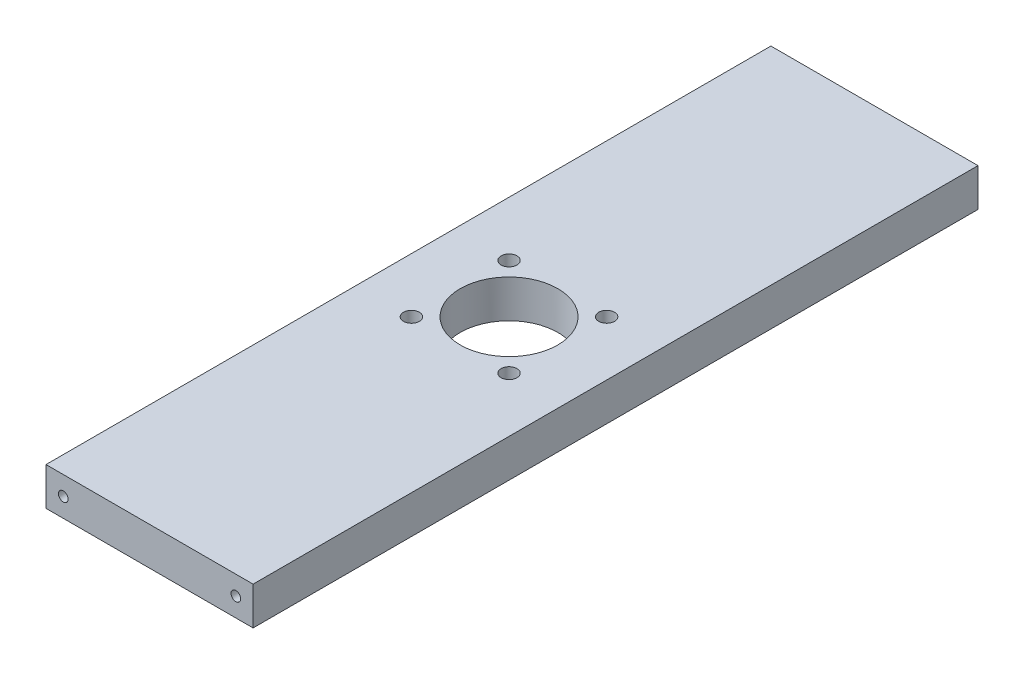
ISO-10303-21;
HEADER;
FILE_DESCRIPTION(('STEP AP214'),'2;1');
FILE_NAME('part.step','',(''),(''),'','','');
FILE_SCHEMA(('AUTOMOTIVE_DESIGN { 1 0 10303 214 1 1 1 1 }'));
ENDSEC;
DATA;
#1=APPLICATION_CONTEXT('core data for automotive mechanical design processes');
#2=APPLICATION_PROTOCOL_DEFINITION('international standard','automotive_design',2000,#1);
#3=PRODUCT_CONTEXT('',#1,'mechanical');
#4=PRODUCT('Part','Part','',(#3));
#5=PRODUCT_RELATED_PRODUCT_CATEGORY('part','',(#4));
#6=PRODUCT_DEFINITION_FORMATION('','',#4);
#7=PRODUCT_DEFINITION_CONTEXT('part definition',#1,'design');
#8=PRODUCT_DEFINITION('design','',#6,#7);
#9=PRODUCT_DEFINITION_SHAPE('','',#8);
#10=(LENGTH_UNIT() NAMED_UNIT(*) SI_UNIT(.MILLI.,.METRE.));
#11=(NAMED_UNIT(*) PLANE_ANGLE_UNIT() SI_UNIT($,.RADIAN.));
#12=(NAMED_UNIT(*) SI_UNIT($,.STERADIAN.) SOLID_ANGLE_UNIT());
#13=UNCERTAINTY_MEASURE_WITH_UNIT(LENGTH_MEASURE(1.E-05),#10,'distance_accuracy_value','');
#14=(GEOMETRIC_REPRESENTATION_CONTEXT(3) GLOBAL_UNCERTAINTY_ASSIGNED_CONTEXT((#13)) GLOBAL_UNIT_ASSIGNED_CONTEXT((#10,
#11,#12)) REPRESENTATION_CONTEXT('',''));
#15=CARTESIAN_POINT('',(0.,0.,0.));
#16=DIRECTION('',(0.,0.,1.));
#17=DIRECTION('',(1.,0.,0.));
#18=AXIS2_PLACEMENT_3D('',#15,#16,#17);
#19=CARTESIAN_POINT('',(-26.1381046087792,10.0518355359765,210.));
#20=DIRECTION('',(1.,0.,0.));
#21=DIRECTION('',(0.,0.,-1.));
#22=AXIS2_PLACEMENT_3D('',#19,#20,#21);
#23=PLANE('',#22);
#24=DIRECTION('',(0.,-1.,0.));
#25=VECTOR('',#24,1.);
#26=CARTESIAN_POINT('',(-26.1381046087792,10.0518355359765,0.));
#27=LINE('',#26,#25);
#28=CARTESIAN_POINT('',(-26.1381046087792,10.0518355359765,0.));
#29=VERTEX_POINT('',#28);
#30=CARTESIAN_POINT('',(-26.1381046087792,-0.948164464023505,0.));
#31=VERTEX_POINT('',#30);
#32=EDGE_CURVE('E98',#29,#31,#27,.T.);
#33=ORIENTED_EDGE('',*,*,#32,.T.);
#34=DIRECTION('',(0.,0.,-1.));
#35=VECTOR('',#34,1.);
#36=CARTESIAN_POINT('',(-26.1381046087792,-0.948164464023505,210.));
#37=LINE('',#36,#35);
#38=CARTESIAN_POINT('',(-26.1381046087792,-0.948164464023505,210.));
#39=VERTEX_POINT('',#38);
#40=EDGE_CURVE('E11',#39,#31,#37,.T.);
#41=ORIENTED_EDGE('',*,*,#40,.F.);
#42=DIRECTION('',(0.,-1.,0.));
#43=VECTOR('',#42,1.);
#44=CARTESIAN_POINT('',(-26.1381046087792,10.0518355359765,210.));
#45=LINE('',#44,#43);
#46=CARTESIAN_POINT('',(-26.1381046087792,10.0518355359765,210.));
#47=VERTEX_POINT('',#46);
#48=EDGE_CURVE('E85',#47,#39,#45,.T.);
#49=ORIENTED_EDGE('',*,*,#48,.F.);
#50=DIRECTION('',(0.,0.,-1.));
#51=VECTOR('',#50,1.);
#52=CARTESIAN_POINT('',(-26.1381046087792,10.0518355359765,210.));
#53=LINE('',#52,#51);
#54=EDGE_CURVE('E94',#47,#29,#53,.T.);
#55=ORIENTED_EDGE('',*,*,#54,.T.);
#56=EDGE_LOOP('',(#33,#41,#49,#55));
#57=FACE_BOUND('',#56,.T.);
#58=ADVANCED_FACE('F32',(#57),#23,.F.);
#59=CARTESIAN_POINT('',(-26.1381046087792,-0.948164464023505,210.));
#60=DIRECTION('',(0.,1.,0.));
#61=DIRECTION('',(0.,0.,1.));
#62=AXIS2_PLACEMENT_3D('',#59,#60,#61);
#63=PLANE('',#62);
#64=CARTESIAN_POINT('',(18.0018953912208,-0.948164464023505,120.));
#65=DIRECTION('',(0.,1.,0.));
#66=DIRECTION('',(0.,0.,1.));
#67=AXIS2_PLACEMENT_3D('',#64,#65,#66);
#68=CIRCLE('',#67,2.3);
#69=CARTESIAN_POINT('',(18.0018953912208,-0.948164464023505,122.3));
#70=VERTEX_POINT('',#69);
#71=EDGE_CURVE('E270',#70,#70,#68,.T.);
#72=ORIENTED_EDGE('',*,*,#71,.T.);
#73=EDGE_LOOP('',(#72));
#74=FACE_BOUND('',#73,.T.);
#75=CARTESIAN_POINT('',(-10.2781046087792,-0.948164464023505,120.));
#76=DIRECTION('',(0.,1.,0.));
#77=DIRECTION('',(0.,0.,1.));
#78=AXIS2_PLACEMENT_3D('',#75,#76,#77);
#79=CIRCLE('',#78,2.3);
#80=CARTESIAN_POINT('',(-10.2781046087792,-0.948164464023505,122.3));
#81=VERTEX_POINT('',#80);
#82=EDGE_CURVE('E265',#81,#81,#79,.T.);
#83=ORIENTED_EDGE('',*,*,#82,.T.);
#84=EDGE_LOOP('',(#83));
#85=FACE_BOUND('',#84,.T.);
#86=CARTESIAN_POINT('',(18.0018953912208,-0.948164464023505,91.72));
#87=DIRECTION('',(0.,1.,0.));
#88=DIRECTION('',(0.,0.,1.));
#89=AXIS2_PLACEMENT_3D('',#86,#87,#88);
#90=CIRCLE('',#89,2.3);
#91=CARTESIAN_POINT('',(18.0018953912208,-0.948164464023505,94.02));
#92=VERTEX_POINT('',#91);
#93=EDGE_CURVE('E254',#92,#92,#90,.T.);
#94=ORIENTED_EDGE('',*,*,#93,.T.);
#95=EDGE_LOOP('',(#94));
#96=FACE_BOUND('',#95,.T.);
#97=CARTESIAN_POINT('',(-10.2781046087792,-0.948164464023505,91.72));
#98=DIRECTION('',(0.,1.,0.));
#99=DIRECTION('',(0.,0.,1.));
#100=AXIS2_PLACEMENT_3D('',#97,#98,#99);
#101=CIRCLE('',#100,2.3);
#102=CARTESIAN_POINT('',(-10.2781046087792,-0.948164464023505,94.02));
#103=VERTEX_POINT('',#102);
#104=EDGE_CURVE('E264',#103,#103,#101,.T.);
#105=ORIENTED_EDGE('',*,*,#104,.T.);
#106=EDGE_LOOP('',(#105));
#107=FACE_BOUND('',#106,.T.);
#108=CARTESIAN_POINT('',(3.86189539122077,-0.948164464023505,105.86));
#109=DIRECTION('',(0.,1.,0.));
#110=DIRECTION('',(0.,0.,1.));
#111=AXIS2_PLACEMENT_3D('',#108,#109,#110);
#112=CIRCLE('',#111,14.14);
#113=CARTESIAN_POINT('',(3.86189539122077,-0.948164464023505,120.));
#114=VERTEX_POINT('',#113);
#115=EDGE_CURVE('E110',#114,#114,#112,.T.);
#116=ORIENTED_EDGE('',*,*,#115,.T.);
#117=EDGE_LOOP('',(#116));
#118=FACE_BOUND('',#117,.T.);
#119=DIRECTION('',(1.,0.,0.));
#120=VECTOR('',#119,1.);
#121=CARTESIAN_POINT('',(-26.1381046087792,-0.948164464023505,0.));
#122=LINE('',#121,#120);
#123=CARTESIAN_POINT('',(33.8618953912208,-0.948164464023505,0.));
#124=VERTEX_POINT('',#123);
#125=EDGE_CURVE('E89',#31,#124,#122,.T.);
#126=ORIENTED_EDGE('',*,*,#125,.T.);
#127=DIRECTION('',(0.,0.,-1.));
#128=VECTOR('',#127,1.);
#129=CARTESIAN_POINT('',(33.8618953912208,-0.948164464023505,210.));
#130=LINE('',#129,#128);
#131=CARTESIAN_POINT('',(33.8618953912208,-0.948164464023505,210.));
#132=VERTEX_POINT('',#131);
#133=EDGE_CURVE('E41',#132,#124,#130,.T.);
#134=ORIENTED_EDGE('',*,*,#133,.F.);
#135=DIRECTION('',(1.,0.,0.));
#136=VECTOR('',#135,1.);
#137=CARTESIAN_POINT('',(-26.1381046087792,-0.948164464023505,210.));
#138=LINE('',#137,#136);
#139=EDGE_CURVE('E80',#39,#132,#138,.T.);
#140=ORIENTED_EDGE('',*,*,#139,.F.);
#141=ORIENTED_EDGE('',*,*,#40,.T.);
#142=EDGE_LOOP('',(#126,#134,#140,#141));
#143=FACE_BOUND('',#142,.T.);
#144=ADVANCED_FACE('F88',(#74,#85,#96,#107,#118,#143),#63,.F.);
#145=CARTESIAN_POINT('',(33.8618953912208,10.0518355359765,210.));
#146=DIRECTION('',(-1.,0.,0.));
#147=DIRECTION('',(0.,0.,1.));
#148=AXIS2_PLACEMENT_3D('',#145,#146,#147);
#149=PLANE('',#148);
#150=DIRECTION('',(0.,1.,0.));
#151=VECTOR('',#150,1.);
#152=CARTESIAN_POINT('',(33.8618953912208,10.0518355359765,0.));
#153=LINE('',#152,#151);
#154=CARTESIAN_POINT('',(33.8618953912208,10.0518355359765,0.));
#155=VERTEX_POINT('',#154);
#156=EDGE_CURVE('E67',#124,#155,#153,.T.);
#157=ORIENTED_EDGE('',*,*,#156,.T.);
#158=DIRECTION('',(0.,0.,-1.));
#159=VECTOR('',#158,1.);
#160=CARTESIAN_POINT('',(33.8618953912208,10.0518355359765,210.));
#161=LINE('',#160,#159);
#162=CARTESIAN_POINT('',(33.8618953912208,10.0518355359765,210.));
#163=VERTEX_POINT('',#162);
#164=EDGE_CURVE('E90',#163,#155,#161,.T.);
#165=ORIENTED_EDGE('',*,*,#164,.F.);
#166=DIRECTION('',(0.,1.,0.));
#167=VECTOR('',#166,1.);
#168=CARTESIAN_POINT('',(33.8618953912208,10.0518355359765,210.));
#169=LINE('',#168,#167);
#170=EDGE_CURVE('E83',#132,#163,#169,.T.);
#171=ORIENTED_EDGE('',*,*,#170,.F.);
#172=ORIENTED_EDGE('',*,*,#133,.T.);
#173=EDGE_LOOP('',(#157,#165,#171,#172));
#174=FACE_BOUND('',#173,.T.);
#175=ADVANCED_FACE('F92',(#174),#149,.F.);
#176=CARTESIAN_POINT('',(-26.1381046087792,10.0518355359765,210.));
#177=DIRECTION('',(0.,-1.,0.));
#178=DIRECTION('',(0.,0.,-1.));
#179=AXIS2_PLACEMENT_3D('',#176,#177,#178);
#180=PLANE('',#179);
#181=CARTESIAN_POINT('',(18.0018953912208,10.0518355359765,120.));
#182=DIRECTION('',(0.,-1.,0.));
#183=DIRECTION('',(0.,0.,-1.));
#184=AXIS2_PLACEMENT_3D('',#181,#182,#183);
#185=CIRCLE('',#184,2.3);
#186=CARTESIAN_POINT('',(18.0018953912208,10.0518355359765,117.7));
#187=VERTEX_POINT('',#186);
#188=EDGE_CURVE('E35',#187,#187,#185,.T.);
#189=ORIENTED_EDGE('',*,*,#188,.T.);
#190=EDGE_LOOP('',(#189));
#191=FACE_BOUND('',#190,.T.);
#192=CARTESIAN_POINT('',(-10.2781046087792,10.0518355359765,120.));
#193=DIRECTION('',(0.,-1.,0.));
#194=DIRECTION('',(0.,0.,-1.));
#195=AXIS2_PLACEMENT_3D('',#192,#193,#194);
#196=CIRCLE('',#195,2.3);
#197=CARTESIAN_POINT('',(-10.2781046087792,10.0518355359765,117.7));
#198=VERTEX_POINT('',#197);
#199=EDGE_CURVE('E115',#198,#198,#196,.T.);
#200=ORIENTED_EDGE('',*,*,#199,.T.);
#201=EDGE_LOOP('',(#200));
#202=FACE_BOUND('',#201,.T.);
#203=CARTESIAN_POINT('',(18.0018953912208,10.0518355359765,91.72));
#204=DIRECTION('',(0.,-1.,0.));
#205=DIRECTION('',(0.,0.,-1.));
#206=AXIS2_PLACEMENT_3D('',#203,#204,#205);
#207=CIRCLE('',#206,2.3);
#208=CARTESIAN_POINT('',(18.0018953912208,10.0518355359765,89.42));
#209=VERTEX_POINT('',#208);
#210=EDGE_CURVE('E113',#209,#209,#207,.T.);
#211=ORIENTED_EDGE('',*,*,#210,.T.);
#212=EDGE_LOOP('',(#211));
#213=FACE_BOUND('',#212,.T.);
#214=CARTESIAN_POINT('',(-10.2781046087792,10.0518355359765,91.72));
#215=DIRECTION('',(0.,-1.,0.));
#216=DIRECTION('',(0.,0.,-1.));
#217=AXIS2_PLACEMENT_3D('',#214,#215,#216);
#218=CIRCLE('',#217,2.3);
#219=CARTESIAN_POINT('',(-10.2781046087792,10.0518355359765,89.42));
#220=VERTEX_POINT('',#219);
#221=EDGE_CURVE('E109',#220,#220,#218,.T.);
#222=ORIENTED_EDGE('',*,*,#221,.T.);
#223=EDGE_LOOP('',(#222));
#224=FACE_BOUND('',#223,.T.);
#225=CARTESIAN_POINT('',(3.86189539122077,10.0518355359765,105.86));
#226=DIRECTION('',(0.,-1.,0.));
#227=DIRECTION('',(0.,0.,-1.));
#228=AXIS2_PLACEMENT_3D('',#225,#226,#227);
#229=CIRCLE('',#228,14.14);
#230=CARTESIAN_POINT('',(3.86189539122077,10.0518355359765,91.72));
#231=VERTEX_POINT('',#230);
#232=EDGE_CURVE('E106',#231,#231,#229,.T.);
#233=ORIENTED_EDGE('',*,*,#232,.T.);
#234=EDGE_LOOP('',(#233));
#235=FACE_BOUND('',#234,.T.);
#236=DIRECTION('',(-1.,0.,0.));
#237=VECTOR('',#236,1.);
#238=CARTESIAN_POINT('',(-26.1381046087792,10.0518355359765,0.));
#239=LINE('',#238,#237);
#240=EDGE_CURVE('E73',#155,#29,#239,.T.);
#241=ORIENTED_EDGE('',*,*,#240,.T.);
#242=ORIENTED_EDGE('',*,*,#54,.F.);
#243=DIRECTION('',(-1.,0.,0.));
#244=VECTOR('',#243,1.);
#245=CARTESIAN_POINT('',(-26.1381046087792,10.0518355359765,210.));
#246=LINE('',#245,#244);
#247=EDGE_CURVE('E50',#163,#47,#246,.T.);
#248=ORIENTED_EDGE('',*,*,#247,.F.);
#249=ORIENTED_EDGE('',*,*,#164,.T.);
#250=EDGE_LOOP('',(#241,#242,#248,#249));
#251=FACE_BOUND('',#250,.T.);
#252=ADVANCED_FACE('F122',(#191,#202,#213,#224,#235,#251),#180,.F.);
#253=CARTESIAN_POINT('',(0.,0.,210.));
#254=DIRECTION('',(0.,0.,1.));
#255=DIRECTION('',(1.,0.,0.));
#256=AXIS2_PLACEMENT_3D('',#253,#254,#255);
#257=PLANE('',#256);
#258=CARTESIAN_POINT('',(-21.1381046087792,4.55183553597649,210.));
#259=DIRECTION('',(0.,0.,1.));
#260=DIRECTION('',(1.,0.,0.));
#261=AXIS2_PLACEMENT_3D('',#258,#259,#260);
#262=CIRCLE('',#261,1.4);
#263=CARTESIAN_POINT('',(-19.7381046087792,4.55183553597649,210.));
#264=VERTEX_POINT('',#263);
#265=EDGE_CURVE('E297',#264,#264,#262,.T.);
#266=ORIENTED_EDGE('',*,*,#265,.F.);
#267=EDGE_LOOP('',(#266));
#268=FACE_BOUND('',#267,.T.);
#269=CARTESIAN_POINT('',(28.8618953912208,4.55183553597649,210.));
#270=DIRECTION('',(0.,0.,1.));
#271=DIRECTION('',(1.,0.,0.));
#272=AXIS2_PLACEMENT_3D('',#269,#270,#271);
#273=CIRCLE('',#272,1.4);
#274=CARTESIAN_POINT('',(30.2618953912208,4.55183553597649,210.));
#275=VERTEX_POINT('',#274);
#276=EDGE_CURVE('E288',#275,#275,#273,.T.);
#277=ORIENTED_EDGE('',*,*,#276,.F.);
#278=EDGE_LOOP('',(#277));
#279=FACE_BOUND('',#278,.T.);
#280=ORIENTED_EDGE('',*,*,#48,.T.);
#281=ORIENTED_EDGE('',*,*,#139,.T.);
#282=ORIENTED_EDGE('',*,*,#170,.T.);
#283=ORIENTED_EDGE('',*,*,#247,.T.);
#284=EDGE_LOOP('',(#280,#281,#282,#283));
#285=FACE_BOUND('',#284,.T.);
#286=ADVANCED_FACE('F81',(#268,#279,#285),#257,.T.);
#287=CARTESIAN_POINT('',(0.,0.,0.));
#288=DIRECTION('',(0.,0.,1.));
#289=DIRECTION('',(1.,0.,0.));
#290=AXIS2_PLACEMENT_3D('',#287,#288,#289);
#291=PLANE('',#290);
#292=CARTESIAN_POINT('',(-21.1381046087792,4.55183553597649,0.));
#293=DIRECTION('',(0.,0.,-1.));
#294=DIRECTION('',(-1.,0.,0.));
#295=AXIS2_PLACEMENT_3D('',#292,#293,#294);
#296=CIRCLE('',#295,1.4);
#297=CARTESIAN_POINT('',(-22.5381046087792,4.55183553597649,0.));
#298=VERTEX_POINT('',#297);
#299=EDGE_CURVE('E281',#298,#298,#296,.T.);
#300=ORIENTED_EDGE('',*,*,#299,.F.);
#301=EDGE_LOOP('',(#300));
#302=FACE_BOUND('',#301,.T.);
#303=CARTESIAN_POINT('',(28.8618953912208,4.55183553597649,0.));
#304=DIRECTION('',(0.,0.,-1.));
#305=DIRECTION('',(-1.,0.,0.));
#306=AXIS2_PLACEMENT_3D('',#303,#304,#305);
#307=CIRCLE('',#306,1.4);
#308=CARTESIAN_POINT('',(27.4618953912208,4.55183553597649,0.));
#309=VERTEX_POINT('',#308);
#310=EDGE_CURVE('E292',#309,#309,#307,.T.);
#311=ORIENTED_EDGE('',*,*,#310,.F.);
#312=EDGE_LOOP('',(#311));
#313=FACE_BOUND('',#312,.T.);
#314=ORIENTED_EDGE('',*,*,#32,.F.);
#315=ORIENTED_EDGE('',*,*,#240,.F.);
#316=ORIENTED_EDGE('',*,*,#156,.F.);
#317=ORIENTED_EDGE('',*,*,#125,.F.);
#318=EDGE_LOOP('',(#314,#315,#316,#317));
#319=FACE_BOUND('',#318,.T.);
#320=ADVANCED_FACE('F150',(#302,#313,#319),#291,.F.);
#321=CARTESIAN_POINT('',(3.86189539122077,-0.948164464023505,105.86));
#322=DIRECTION('',(0.,1.,0.));
#323=DIRECTION('',(0.,0.,1.));
#324=AXIS2_PLACEMENT_3D('',#321,#322,#323);
#325=CYLINDRICAL_SURFACE('',#324,14.14);
#326=ORIENTED_EDGE('',*,*,#115,.F.);
#327=EDGE_LOOP('',(#326));
#328=FACE_BOUND('',#327,.T.);
#329=ORIENTED_EDGE('',*,*,#232,.F.);
#330=EDGE_LOOP('',(#329));
#331=FACE_BOUND('',#330,.T.);
#332=ADVANCED_FACE('F152',(#328,#331),#325,.F.);
#333=CARTESIAN_POINT('',(-10.2781046087792,-0.948164464023505,91.72));
#334=DIRECTION('',(0.,1.,0.));
#335=DIRECTION('',(0.,0.,1.));
#336=AXIS2_PLACEMENT_3D('',#333,#334,#335);
#337=CYLINDRICAL_SURFACE('',#336,2.3);
#338=ORIENTED_EDGE('',*,*,#104,.F.);
#339=EDGE_LOOP('',(#338));
#340=FACE_BOUND('',#339,.T.);
#341=ORIENTED_EDGE('',*,*,#221,.F.);
#342=EDGE_LOOP('',(#341));
#343=FACE_BOUND('',#342,.T.);
#344=ADVANCED_FACE('F159',(#340,#343),#337,.F.);
#345=CARTESIAN_POINT('',(18.0018953912208,-0.948164464023505,91.72));
#346=DIRECTION('',(0.,1.,0.));
#347=DIRECTION('',(0.,0.,1.));
#348=AXIS2_PLACEMENT_3D('',#345,#346,#347);
#349=CYLINDRICAL_SURFACE('',#348,2.3);
#350=ORIENTED_EDGE('',*,*,#93,.F.);
#351=EDGE_LOOP('',(#350));
#352=FACE_BOUND('',#351,.T.);
#353=ORIENTED_EDGE('',*,*,#210,.F.);
#354=EDGE_LOOP('',(#353));
#355=FACE_BOUND('',#354,.T.);
#356=ADVANCED_FACE('F137',(#352,#355),#349,.F.);
#357=CARTESIAN_POINT('',(-10.2781046087792,-0.948164464023505,120.));
#358=DIRECTION('',(0.,1.,0.));
#359=DIRECTION('',(0.,0.,1.));
#360=AXIS2_PLACEMENT_3D('',#357,#358,#359);
#361=CYLINDRICAL_SURFACE('',#360,2.3);
#362=ORIENTED_EDGE('',*,*,#82,.F.);
#363=EDGE_LOOP('',(#362));
#364=FACE_BOUND('',#363,.T.);
#365=ORIENTED_EDGE('',*,*,#199,.F.);
#366=EDGE_LOOP('',(#365));
#367=FACE_BOUND('',#366,.T.);
#368=ADVANCED_FACE('F127',(#364,#367),#361,.F.);
#369=CARTESIAN_POINT('',(18.0018953912208,-0.948164464023505,120.));
#370=DIRECTION('',(0.,1.,0.));
#371=DIRECTION('',(0.,0.,1.));
#372=AXIS2_PLACEMENT_3D('',#369,#370,#371);
#373=CYLINDRICAL_SURFACE('',#372,2.3);
#374=ORIENTED_EDGE('',*,*,#71,.F.);
#375=EDGE_LOOP('',(#374));
#376=FACE_BOUND('',#375,.T.);
#377=ORIENTED_EDGE('',*,*,#188,.F.);
#378=EDGE_LOOP('',(#377));
#379=FACE_BOUND('',#378,.T.);
#380=ADVANCED_FACE('F124',(#376,#379),#373,.F.);
#381=CARTESIAN_POINT('',(28.8618953912208,4.55183553597649,21.));
#382=DIRECTION('',(0.,0.,-1.));
#383=DIRECTION('',(-1.,0.,0.));
#384=AXIS2_PLACEMENT_3D('',#381,#382,#383);
#385=CYLINDRICAL_SURFACE('',#384,1.4);
#386=CARTESIAN_POINT('',(28.8618953912208,4.55183553597649,21.));
#387=DIRECTION('',(0.,0.,-1.));
#388=DIRECTION('',(-1.,0.,0.));
#389=AXIS2_PLACEMENT_3D('',#386,#387,#388);
#390=CIRCLE('',#389,1.4);
#391=CARTESIAN_POINT('',(27.4618953912208,4.55183553597649,21.));
#392=VERTEX_POINT('',#391);
#393=EDGE_CURVE('E285',#392,#392,#390,.T.);
#394=CARTESIAN_POINT('',(27.4618953912208,4.55183553597649,21.));
#395=CARTESIAN_POINT('',(27.4618953912208,4.55183553597649,20.78125));
#396=CARTESIAN_POINT('',(27.4618953912208,4.55183553597649,20.5625));
#397=CARTESIAN_POINT('',(27.4618953912208,4.55183553597649,20.125));
#398=CARTESIAN_POINT('',(27.4618953912208,4.55183553597649,19.90625));
#399=CARTESIAN_POINT('',(27.4618953912208,4.55183553597649,19.46875));
#400=CARTESIAN_POINT('',(27.4618953912208,4.55183553597649,19.25));
#401=CARTESIAN_POINT('',(27.4618953912208,4.55183553597649,18.8125));
#402=CARTESIAN_POINT('',(27.4618953912208,4.55183553597649,18.59375));
#403=CARTESIAN_POINT('',(27.4618953912208,4.55183553597649,18.15625));
#404=CARTESIAN_POINT('',(27.4618953912208,4.55183553597649,17.9375));
#405=CARTESIAN_POINT('',(27.4618953912208,4.55183553597649,17.5));
#406=CARTESIAN_POINT('',(27.4618953912208,4.55183553597649,17.28125));
#407=CARTESIAN_POINT('',(27.4618953912208,4.55183553597649,16.84375));
#408=CARTESIAN_POINT('',(27.4618953912208,4.55183553597649,16.625));
#409=CARTESIAN_POINT('',(27.4618953912208,4.55183553597649,16.1875));
#410=CARTESIAN_POINT('',(27.4618953912208,4.55183553597649,15.96875));
#411=CARTESIAN_POINT('',(27.4618953912208,4.55183553597649,15.53125));
#412=CARTESIAN_POINT('',(27.4618953912208,4.55183553597649,15.3125));
#413=CARTESIAN_POINT('',(27.4618953912208,4.55183553597649,14.875));
#414=CARTESIAN_POINT('',(27.4618953912208,4.55183553597649,14.65625));
#415=CARTESIAN_POINT('',(27.4618953912208,4.55183553597649,14.21875));
#416=CARTESIAN_POINT('',(27.4618953912208,4.55183553597649,14.));
#417=CARTESIAN_POINT('',(27.4618953912208,4.55183553597649,13.5625));
#418=CARTESIAN_POINT('',(27.4618953912208,4.55183553597649,13.34375));
#419=CARTESIAN_POINT('',(27.4618953912208,4.55183553597649,12.90625));
#420=CARTESIAN_POINT('',(27.4618953912208,4.55183553597649,12.6875));
#421=CARTESIAN_POINT('',(27.4618953912208,4.55183553597649,12.25));
#422=CARTESIAN_POINT('',(27.4618953912208,4.55183553597649,12.03125));
#423=CARTESIAN_POINT('',(27.4618953912208,4.55183553597649,11.59375));
#424=CARTESIAN_POINT('',(27.4618953912208,4.55183553597649,11.375));
#425=CARTESIAN_POINT('',(27.4618953912208,4.55183553597649,10.9375));
#426=CARTESIAN_POINT('',(27.4618953912208,4.55183553597649,10.71875));
#427=CARTESIAN_POINT('',(27.4618953912208,4.55183553597649,10.28125));
#428=CARTESIAN_POINT('',(27.4618953912208,4.55183553597649,10.0625));
#429=CARTESIAN_POINT('',(27.4618953912208,4.55183553597649,9.625));
#430=CARTESIAN_POINT('',(27.4618953912208,4.55183553597649,9.40625));
#431=CARTESIAN_POINT('',(27.4618953912208,4.55183553597649,8.96875));
#432=CARTESIAN_POINT('',(27.4618953912208,4.55183553597649,8.75));
#433=CARTESIAN_POINT('',(27.4618953912208,4.55183553597649,8.3125));
#434=CARTESIAN_POINT('',(27.4618953912208,4.55183553597649,8.09375));
#435=CARTESIAN_POINT('',(27.4618953912208,4.55183553597649,7.65625));
#436=CARTESIAN_POINT('',(27.4618953912208,4.55183553597649,7.4375));
#437=CARTESIAN_POINT('',(27.4618953912208,4.55183553597649,7.));
#438=CARTESIAN_POINT('',(27.4618953912208,4.55183553597649,6.78125));
#439=CARTESIAN_POINT('',(27.4618953912208,4.55183553597649,6.34375));
#440=CARTESIAN_POINT('',(27.4618953912208,4.55183553597649,6.125));
#441=CARTESIAN_POINT('',(27.4618953912208,4.55183553597649,5.6875));
#442=CARTESIAN_POINT('',(27.4618953912208,4.55183553597649,5.46875));
#443=CARTESIAN_POINT('',(27.4618953912208,4.55183553597649,5.03125));
#444=CARTESIAN_POINT('',(27.4618953912208,4.55183553597649,4.8125));
#445=CARTESIAN_POINT('',(27.4618953912208,4.55183553597649,4.375));
#446=CARTESIAN_POINT('',(27.4618953912208,4.55183553597649,4.15625));
#447=CARTESIAN_POINT('',(27.4618953912208,4.55183553597649,3.71875));
#448=CARTESIAN_POINT('',(27.4618953912208,4.55183553597649,3.5));
#449=CARTESIAN_POINT('',(27.4618953912208,4.55183553597649,3.0625));
#450=CARTESIAN_POINT('',(27.4618953912208,4.55183553597649,2.84375));
#451=CARTESIAN_POINT('',(27.4618953912208,4.55183553597649,2.40625));
#452=CARTESIAN_POINT('',(27.4618953912208,4.55183553597649,2.1875));
#453=CARTESIAN_POINT('',(27.4618953912208,4.55183553597649,1.75));
#454=CARTESIAN_POINT('',(27.4618953912208,4.55183553597649,1.53125));
#455=CARTESIAN_POINT('',(27.4618953912208,4.55183553597649,1.09375));
#456=CARTESIAN_POINT('',(27.4618953912208,4.55183553597649,0.875000000000001));
#457=CARTESIAN_POINT('',(27.4618953912208,4.55183553597649,0.4375));
#458=CARTESIAN_POINT('',(27.4618953912208,4.55183553597649,0.21875));
#459=CARTESIAN_POINT('',(27.4618953912208,4.55183553597649,0.));
#460=B_SPLINE_CURVE_WITH_KNOTS('',3,(#394,#395,#396,#397,#398,#399,#400,#401,#402,#403,#404,
#405,#406,#407,#408,#409,#410,#411,#412,#413,#414,#415,#416,#417,#418,#419,#420,#421,#422,#423,
#424,#425,#426,#427,#428,#429,#430,#431,#432,#433,#434,#435,#436,#437,#438,#439,#440,#441,#442,
#443,#444,#445,#446,#447,#448,#449,#450,#451,#452,#453,#454,#455,#456,#457,#458,#459),
.UNSPECIFIED.,.F.,.F.,(4,2,2,2,2,2,2,2,2,2,2,2,2,2,2,2,2,2,2,2,2,2,2,2,2,2,2,2,2,2,2,2,4),(0.,
0.656250000000001,1.3125,1.96875,2.625,3.28125,3.9375,4.59375,5.25,5.90625,6.5625,7.21875,7.875,
8.53125,9.1875,9.84375,10.5,11.15625,11.8125,12.46875,13.125,13.78125,14.4375,15.09375,15.75,
16.40625,17.0625,17.71875,18.375,19.03125,19.6875,20.34375,21.),.UNSPECIFIED.);
#461=EDGE_CURVE('BSEAM126',#392,#309,#460,.T.);
#462=ORIENTED_EDGE('',*,*,#393,.F.);
#463=ORIENTED_EDGE('',*,*,#310,.T.);
#464=ORIENTED_EDGE('',*,*,#461,.T.);
#465=ORIENTED_EDGE('',*,*,#461,.F.);
#466=EDGE_LOOP('',(#462,#464,#463,#465));
#467=FACE_BOUND('',#466,.T.);
#468=ADVANCED_FACE('F126',(#467),#385,.F.);
#469=CARTESIAN_POINT('',(28.8618953912208,4.55183553597649,21.));
#470=DIRECTION('',(0.,0.,-1.));
#471=DIRECTION('',(-1.,0.,0.));
#472=AXIS2_PLACEMENT_3D('',#469,#470,#471);
#473=PLANE('',#472);
#474=ORIENTED_EDGE('',*,*,#393,.T.);
#475=EDGE_LOOP('',(#474));
#476=FACE_BOUND('',#475,.T.);
#477=ADVANCED_FACE('F134',(#476),#473,.T.);
#478=CARTESIAN_POINT('',(-21.1381046087792,4.55183553597649,21.));
#479=DIRECTION('',(0.,0.,-1.));
#480=DIRECTION('',(-1.,0.,0.));
#481=AXIS2_PLACEMENT_3D('',#478,#479,#480);
#482=CYLINDRICAL_SURFACE('',#481,1.4);
#483=CARTESIAN_POINT('',(-21.1381046087792,4.55183553597649,21.));
#484=DIRECTION('',(0.,0.,-1.));
#485=DIRECTION('',(-1.,0.,0.));
#486=AXIS2_PLACEMENT_3D('',#483,#484,#485);
#487=CIRCLE('',#486,1.4);
#488=CARTESIAN_POINT('',(-22.5381046087792,4.55183553597649,21.));
#489=VERTEX_POINT('',#488);
#490=EDGE_CURVE('E276',#489,#489,#487,.T.);
#491=CARTESIAN_POINT('',(-22.5381046087792,4.55183553597649,21.));
#492=CARTESIAN_POINT('',(-22.5381046087792,4.55183553597649,20.78125));
#493=CARTESIAN_POINT('',(-22.5381046087792,4.55183553597649,20.5625));
#494=CARTESIAN_POINT('',(-22.5381046087792,4.55183553597649,20.125));
#495=CARTESIAN_POINT('',(-22.5381046087792,4.55183553597649,19.90625));
#496=CARTESIAN_POINT('',(-22.5381046087792,4.55183553597649,19.46875));
#497=CARTESIAN_POINT('',(-22.5381046087792,4.55183553597649,19.25));
#498=CARTESIAN_POINT('',(-22.5381046087792,4.55183553597649,18.8125));
#499=CARTESIAN_POINT('',(-22.5381046087792,4.55183553597649,18.59375));
#500=CARTESIAN_POINT('',(-22.5381046087792,4.55183553597649,18.15625));
#501=CARTESIAN_POINT('',(-22.5381046087792,4.55183553597649,17.9375));
#502=CARTESIAN_POINT('',(-22.5381046087792,4.55183553597649,17.5));
#503=CARTESIAN_POINT('',(-22.5381046087792,4.55183553597649,17.28125));
#504=CARTESIAN_POINT('',(-22.5381046087792,4.55183553597649,16.84375));
#505=CARTESIAN_POINT('',(-22.5381046087792,4.55183553597649,16.625));
#506=CARTESIAN_POINT('',(-22.5381046087792,4.55183553597649,16.1875));
#507=CARTESIAN_POINT('',(-22.5381046087792,4.55183553597649,15.96875));
#508=CARTESIAN_POINT('',(-22.5381046087792,4.55183553597649,15.53125));
#509=CARTESIAN_POINT('',(-22.5381046087792,4.55183553597649,15.3125));
#510=CARTESIAN_POINT('',(-22.5381046087792,4.55183553597649,14.875));
#511=CARTESIAN_POINT('',(-22.5381046087792,4.55183553597649,14.65625));
#512=CARTESIAN_POINT('',(-22.5381046087792,4.55183553597649,14.21875));
#513=CARTESIAN_POINT('',(-22.5381046087792,4.55183553597649,14.));
#514=CARTESIAN_POINT('',(-22.5381046087792,4.55183553597649,13.5625));
#515=CARTESIAN_POINT('',(-22.5381046087792,4.55183553597649,13.34375));
#516=CARTESIAN_POINT('',(-22.5381046087792,4.55183553597649,12.90625));
#517=CARTESIAN_POINT('',(-22.5381046087792,4.55183553597649,12.6875));
#518=CARTESIAN_POINT('',(-22.5381046087792,4.55183553597649,12.25));
#519=CARTESIAN_POINT('',(-22.5381046087792,4.55183553597649,12.03125));
#520=CARTESIAN_POINT('',(-22.5381046087792,4.55183553597649,11.59375));
#521=CARTESIAN_POINT('',(-22.5381046087792,4.55183553597649,11.375));
#522=CARTESIAN_POINT('',(-22.5381046087792,4.55183553597649,10.9375));
#523=CARTESIAN_POINT('',(-22.5381046087792,4.55183553597649,10.71875));
#524=CARTESIAN_POINT('',(-22.5381046087792,4.55183553597649,10.28125));
#525=CARTESIAN_POINT('',(-22.5381046087792,4.55183553597649,10.0625));
#526=CARTESIAN_POINT('',(-22.5381046087792,4.55183553597649,9.625));
#527=CARTESIAN_POINT('',(-22.5381046087792,4.55183553597649,9.40625));
#528=CARTESIAN_POINT('',(-22.5381046087792,4.55183553597649,8.96875));
#529=CARTESIAN_POINT('',(-22.5381046087792,4.55183553597649,8.75));
#530=CARTESIAN_POINT('',(-22.5381046087792,4.55183553597649,8.3125));
#531=CARTESIAN_POINT('',(-22.5381046087792,4.55183553597649,8.09375));
#532=CARTESIAN_POINT('',(-22.5381046087792,4.55183553597649,7.65625));
#533=CARTESIAN_POINT('',(-22.5381046087792,4.55183553597649,7.4375));
#534=CARTESIAN_POINT('',(-22.5381046087792,4.55183553597649,7.));
#535=CARTESIAN_POINT('',(-22.5381046087792,4.55183553597649,6.78125));
#536=CARTESIAN_POINT('',(-22.5381046087792,4.55183553597649,6.34375));
#537=CARTESIAN_POINT('',(-22.5381046087792,4.55183553597649,6.125));
#538=CARTESIAN_POINT('',(-22.5381046087792,4.55183553597649,5.6875));
#539=CARTESIAN_POINT('',(-22.5381046087792,4.55183553597649,5.46875));
#540=CARTESIAN_POINT('',(-22.5381046087792,4.55183553597649,5.03125));
#541=CARTESIAN_POINT('',(-22.5381046087792,4.55183553597649,4.8125));
#542=CARTESIAN_POINT('',(-22.5381046087792,4.55183553597649,4.375));
#543=CARTESIAN_POINT('',(-22.5381046087792,4.55183553597649,4.15625));
#544=CARTESIAN_POINT('',(-22.5381046087792,4.55183553597649,3.71875));
#545=CARTESIAN_POINT('',(-22.5381046087792,4.55183553597649,3.5));
#546=CARTESIAN_POINT('',(-22.5381046087792,4.55183553597649,3.0625));
#547=CARTESIAN_POINT('',(-22.5381046087792,4.55183553597649,2.84375));
#548=CARTESIAN_POINT('',(-22.5381046087792,4.55183553597649,2.40625));
#549=CARTESIAN_POINT('',(-22.5381046087792,4.55183553597649,2.1875));
#550=CARTESIAN_POINT('',(-22.5381046087792,4.55183553597649,1.75));
#551=CARTESIAN_POINT('',(-22.5381046087792,4.55183553597649,1.53125));
#552=CARTESIAN_POINT('',(-22.5381046087792,4.55183553597649,1.09375));
#553=CARTESIAN_POINT('',(-22.5381046087792,4.55183553597649,0.875000000000001));
#554=CARTESIAN_POINT('',(-22.5381046087792,4.55183553597649,0.4375));
#555=CARTESIAN_POINT('',(-22.5381046087792,4.55183553597649,0.21875));
#556=CARTESIAN_POINT('',(-22.5381046087792,4.55183553597649,0.));
#557=B_SPLINE_CURVE_WITH_KNOTS('',3,(#491,#492,#493,#494,#495,#496,#497,#498,#499,#500,#501,
#502,#503,#504,#505,#506,#507,#508,#509,#510,#511,#512,#513,#514,#515,#516,#517,#518,#519,#520,
#521,#522,#523,#524,#525,#526,#527,#528,#529,#530,#531,#532,#533,#534,#535,#536,#537,#538,#539,
#540,#541,#542,#543,#544,#545,#546,#547,#548,#549,#550,#551,#552,#553,#554,#555,#556),
.UNSPECIFIED.,.F.,.F.,(4,2,2,2,2,2,2,2,2,2,2,2,2,2,2,2,2,2,2,2,2,2,2,2,2,2,2,2,2,2,2,2,4),(0.,
0.656250000000001,1.3125,1.96875,2.625,3.28125,3.9375,4.59375,5.25,5.90625,6.5625,7.21875,7.875,
8.53125,9.1875,9.84375,10.5,11.15625,11.8125,12.46875,13.125,13.78125,14.4375,15.09375,15.75,
16.40625,17.0625,17.71875,18.375,19.03125,19.6875,20.34375,21.),.UNSPECIFIED.);
#558=EDGE_CURVE('BSEAM236',#489,#298,#557,.T.);
#559=ORIENTED_EDGE('',*,*,#490,.F.);
#560=ORIENTED_EDGE('',*,*,#299,.T.);
#561=ORIENTED_EDGE('',*,*,#558,.T.);
#562=ORIENTED_EDGE('',*,*,#558,.F.);
#563=EDGE_LOOP('',(#559,#561,#560,#562));
#564=FACE_BOUND('',#563,.T.);
#565=ADVANCED_FACE('F236',(#564),#482,.F.);
#566=CARTESIAN_POINT('',(-21.1381046087792,4.55183553597649,21.));
#567=DIRECTION('',(0.,0.,-1.));
#568=DIRECTION('',(-1.,0.,0.));
#569=AXIS2_PLACEMENT_3D('',#566,#567,#568);
#570=PLANE('',#569);
#571=ORIENTED_EDGE('',*,*,#490,.T.);
#572=EDGE_LOOP('',(#571));
#573=FACE_BOUND('',#572,.T.);
#574=ADVANCED_FACE('F189',(#573),#570,.T.);
#575=CARTESIAN_POINT('',(28.8618953912208,4.55183553597649,189.));
#576=DIRECTION('',(0.,0.,1.));
#577=DIRECTION('',(1.,0.,0.));
#578=AXIS2_PLACEMENT_3D('',#575,#576,#577);
#579=CYLINDRICAL_SURFACE('',#578,1.4);
#580=CARTESIAN_POINT('',(28.8618953912208,4.55183553597649,189.));
#581=DIRECTION('',(0.,0.,1.));
#582=DIRECTION('',(1.,0.,0.));
#583=AXIS2_PLACEMENT_3D('',#580,#581,#582);
#584=CIRCLE('',#583,1.4);
#585=CARTESIAN_POINT('',(30.2618953912208,4.55183553597649,189.));
#586=VERTEX_POINT('',#585);
#587=EDGE_CURVE('E301',#586,#586,#584,.T.);
#588=CARTESIAN_POINT('',(30.2618953912208,4.55183553597649,189.));
#589=CARTESIAN_POINT('',(30.2618953912208,4.55183553597649,189.21875));
#590=CARTESIAN_POINT('',(30.2618953912208,4.55183553597649,189.4375));
#591=CARTESIAN_POINT('',(30.2618953912208,4.55183553597649,189.875));
#592=CARTESIAN_POINT('',(30.2618953912208,4.55183553597649,190.09375));
#593=CARTESIAN_POINT('',(30.2618953912208,4.55183553597649,190.53125));
#594=CARTESIAN_POINT('',(30.2618953912208,4.55183553597649,190.75));
#595=CARTESIAN_POINT('',(30.2618953912208,4.55183553597649,191.1875));
#596=CARTESIAN_POINT('',(30.2618953912208,4.55183553597649,191.40625));
#597=CARTESIAN_POINT('',(30.2618953912208,4.55183553597649,191.84375));
#598=CARTESIAN_POINT('',(30.2618953912208,4.55183553597649,192.0625));
#599=CARTESIAN_POINT('',(30.2618953912208,4.55183553597649,192.5));
#600=CARTESIAN_POINT('',(30.2618953912208,4.55183553597649,192.71875));
#601=CARTESIAN_POINT('',(30.2618953912208,4.55183553597649,193.15625));
#602=CARTESIAN_POINT('',(30.2618953912208,4.55183553597649,193.375));
#603=CARTESIAN_POINT('',(30.2618953912208,4.55183553597649,193.8125));
#604=CARTESIAN_POINT('',(30.2618953912208,4.55183553597649,194.03125));
#605=CARTESIAN_POINT('',(30.2618953912208,4.55183553597649,194.46875));
#606=CARTESIAN_POINT('',(30.2618953912208,4.55183553597649,194.6875));
#607=CARTESIAN_POINT('',(30.2618953912208,4.55183553597649,195.125));
#608=CARTESIAN_POINT('',(30.2618953912208,4.55183553597649,195.34375));
#609=CARTESIAN_POINT('',(30.2618953912208,4.55183553597649,195.78125));
#610=CARTESIAN_POINT('',(30.2618953912208,4.55183553597649,196.));
#611=CARTESIAN_POINT('',(30.2618953912208,4.55183553597649,196.4375));
#612=CARTESIAN_POINT('',(30.2618953912208,4.55183553597649,196.65625));
#613=CARTESIAN_POINT('',(30.2618953912208,4.55183553597649,197.09375));
#614=CARTESIAN_POINT('',(30.2618953912208,4.55183553597649,197.3125));
#615=CARTESIAN_POINT('',(30.2618953912208,4.55183553597649,197.75));
#616=CARTESIAN_POINT('',(30.2618953912208,4.55183553597649,197.96875));
#617=CARTESIAN_POINT('',(30.2618953912208,4.55183553597649,198.40625));
#618=CARTESIAN_POINT('',(30.2618953912208,4.55183553597649,198.625));
#619=CARTESIAN_POINT('',(30.2618953912208,4.55183553597649,199.0625));
#620=CARTESIAN_POINT('',(30.2618953912208,4.55183553597649,199.28125));
#621=CARTESIAN_POINT('',(30.2618953912208,4.55183553597649,199.71875));
#622=CARTESIAN_POINT('',(30.2618953912208,4.55183553597649,199.9375));
#623=CARTESIAN_POINT('',(30.2618953912208,4.55183553597649,200.375));
#624=CARTESIAN_POINT('',(30.2618953912208,4.55183553597649,200.59375));
#625=CARTESIAN_POINT('',(30.2618953912208,4.55183553597649,201.03125));
#626=CARTESIAN_POINT('',(30.2618953912208,4.55183553597649,201.25));
#627=CARTESIAN_POINT('',(30.2618953912208,4.55183553597649,201.6875));
#628=CARTESIAN_POINT('',(30.2618953912208,4.55183553597649,201.90625));
#629=CARTESIAN_POINT('',(30.2618953912208,4.55183553597649,202.34375));
#630=CARTESIAN_POINT('',(30.2618953912208,4.55183553597649,202.5625));
#631=CARTESIAN_POINT('',(30.2618953912208,4.55183553597649,203.));
#632=CARTESIAN_POINT('',(30.2618953912208,4.55183553597649,203.21875));
#633=CARTESIAN_POINT('',(30.2618953912208,4.55183553597649,203.65625));
#634=CARTESIAN_POINT('',(30.2618953912208,4.55183553597649,203.875));
#635=CARTESIAN_POINT('',(30.2618953912208,4.55183553597649,204.3125));
#636=CARTESIAN_POINT('',(30.2618953912208,4.55183553597649,204.53125));
#637=CARTESIAN_POINT('',(30.2618953912208,4.55183553597649,204.96875));
#638=CARTESIAN_POINT('',(30.2618953912208,4.55183553597649,205.1875));
#639=CARTESIAN_POINT('',(30.2618953912208,4.55183553597649,205.625));
#640=CARTESIAN_POINT('',(30.2618953912208,4.55183553597649,205.84375));
#641=CARTESIAN_POINT('',(30.2618953912208,4.55183553597649,206.28125));
#642=CARTESIAN_POINT('',(30.2618953912208,4.55183553597649,206.5));
#643=CARTESIAN_POINT('',(30.2618953912208,4.55183553597649,206.9375));
#644=CARTESIAN_POINT('',(30.2618953912208,4.55183553597649,207.15625));
#645=CARTESIAN_POINT('',(30.2618953912208,4.55183553597649,207.59375));
#646=CARTESIAN_POINT('',(30.2618953912208,4.55183553597649,207.8125));
#647=CARTESIAN_POINT('',(30.2618953912208,4.55183553597649,208.25));
#648=CARTESIAN_POINT('',(30.2618953912208,4.55183553597649,208.46875));
#649=CARTESIAN_POINT('',(30.2618953912208,4.55183553597649,208.90625));
#650=CARTESIAN_POINT('',(30.2618953912208,4.55183553597649,209.125));
#651=CARTESIAN_POINT('',(30.2618953912208,4.55183553597649,209.5625));
#652=CARTESIAN_POINT('',(30.2618953912208,4.55183553597649,209.78125));
#653=CARTESIAN_POINT('',(30.2618953912208,4.55183553597649,210.));
#654=B_SPLINE_CURVE_WITH_KNOTS('',3,(#588,#589,#590,#591,#592,#593,#594,#595,#596,#597,#598,
#599,#600,#601,#602,#603,#604,#605,#606,#607,#608,#609,#610,#611,#612,#613,#614,#615,#616,#617,
#618,#619,#620,#621,#622,#623,#624,#625,#626,#627,#628,#629,#630,#631,#632,#633,#634,#635,#636,
#637,#638,#639,#640,#641,#642,#643,#644,#645,#646,#647,#648,#649,#650,#651,#652,#653),
.UNSPECIFIED.,.F.,.F.,(4,2,2,2,2,2,2,2,2,2,2,2,2,2,2,2,2,2,2,2,2,2,2,2,2,2,2,2,2,2,2,2,4),(0.,
0.656250000000025,1.31250000000002,1.96875000000002,2.62500000000002,3.28125000000001,
3.93750000000001,4.59375000000001,5.25,5.90625,6.5625,7.21875000000002,7.87500000000002,
8.53125000000002,9.18750000000001,9.84375000000001,10.5,11.15625,11.8125,12.46875,13.125,
13.78125,14.4375,15.09375,15.75,16.40625,17.0625,17.71875,18.375,19.03125,19.6875,20.34375,21.),.UNSPECIFIED.);
#655=EDGE_CURVE('BSEAM194',#586,#275,#654,.T.);
#656=ORIENTED_EDGE('',*,*,#587,.F.);
#657=ORIENTED_EDGE('',*,*,#276,.T.);
#658=ORIENTED_EDGE('',*,*,#655,.T.);
#659=ORIENTED_EDGE('',*,*,#655,.F.);
#660=EDGE_LOOP('',(#656,#658,#657,#659));
#661=FACE_BOUND('',#660,.T.);
#662=ADVANCED_FACE('F194',(#661),#579,.F.);
#663=CARTESIAN_POINT('',(28.8618953912208,4.55183553597649,189.));
#664=DIRECTION('',(0.,0.,1.));
#665=DIRECTION('',(1.,0.,0.));
#666=AXIS2_PLACEMENT_3D('',#663,#664,#665);
#667=PLANE('',#666);
#668=ORIENTED_EDGE('',*,*,#587,.T.);
#669=EDGE_LOOP('',(#668));
#670=FACE_BOUND('',#669,.T.);
#671=ADVANCED_FACE('F199',(#670),#667,.T.);
#672=CARTESIAN_POINT('',(-21.1381046087792,4.55183553597649,189.));
#673=DIRECTION('',(0.,0.,1.));
#674=DIRECTION('',(1.,0.,0.));
#675=AXIS2_PLACEMENT_3D('',#672,#673,#674);
#676=CYLINDRICAL_SURFACE('',#675,1.4);
#677=CARTESIAN_POINT('',(-21.1381046087792,4.55183553597649,189.));
#678=DIRECTION('',(0.,0.,1.));
#679=DIRECTION('',(1.,0.,0.));
#680=AXIS2_PLACEMENT_3D('',#677,#678,#679);
#681=CIRCLE('',#680,1.4);
#682=CARTESIAN_POINT('',(-19.7381046087792,4.55183553597649,189.));
#683=VERTEX_POINT('',#682);
#684=EDGE_CURVE('E294',#683,#683,#681,.T.);
#685=CARTESIAN_POINT('',(-19.7381046087792,4.55183553597649,189.));
#686=CARTESIAN_POINT('',(-19.7381046087792,4.55183553597649,189.21875));
#687=CARTESIAN_POINT('',(-19.7381046087792,4.55183553597649,189.4375));
#688=CARTESIAN_POINT('',(-19.7381046087792,4.55183553597649,189.875));
#689=CARTESIAN_POINT('',(-19.7381046087792,4.55183553597649,190.09375));
#690=CARTESIAN_POINT('',(-19.7381046087792,4.55183553597649,190.53125));
#691=CARTESIAN_POINT('',(-19.7381046087792,4.55183553597649,190.75));
#692=CARTESIAN_POINT('',(-19.7381046087792,4.55183553597649,191.1875));
#693=CARTESIAN_POINT('',(-19.7381046087792,4.55183553597649,191.40625));
#694=CARTESIAN_POINT('',(-19.7381046087792,4.55183553597649,191.84375));
#695=CARTESIAN_POINT('',(-19.7381046087792,4.55183553597649,192.0625));
#696=CARTESIAN_POINT('',(-19.7381046087792,4.55183553597649,192.5));
#697=CARTESIAN_POINT('',(-19.7381046087792,4.55183553597649,192.71875));
#698=CARTESIAN_POINT('',(-19.7381046087792,4.55183553597649,193.15625));
#699=CARTESIAN_POINT('',(-19.7381046087792,4.55183553597649,193.375));
#700=CARTESIAN_POINT('',(-19.7381046087792,4.55183553597649,193.8125));
#701=CARTESIAN_POINT('',(-19.7381046087792,4.55183553597649,194.03125));
#702=CARTESIAN_POINT('',(-19.7381046087792,4.55183553597649,194.46875));
#703=CARTESIAN_POINT('',(-19.7381046087792,4.55183553597649,194.6875));
#704=CARTESIAN_POINT('',(-19.7381046087792,4.55183553597649,195.125));
#705=CARTESIAN_POINT('',(-19.7381046087792,4.55183553597649,195.34375));
#706=CARTESIAN_POINT('',(-19.7381046087792,4.55183553597649,195.78125));
#707=CARTESIAN_POINT('',(-19.7381046087792,4.55183553597649,196.));
#708=CARTESIAN_POINT('',(-19.7381046087792,4.55183553597649,196.4375));
#709=CARTESIAN_POINT('',(-19.7381046087792,4.55183553597649,196.65625));
#710=CARTESIAN_POINT('',(-19.7381046087792,4.55183553597649,197.09375));
#711=CARTESIAN_POINT('',(-19.7381046087792,4.55183553597649,197.3125));
#712=CARTESIAN_POINT('',(-19.7381046087792,4.55183553597649,197.75));
#713=CARTESIAN_POINT('',(-19.7381046087792,4.55183553597649,197.96875));
#714=CARTESIAN_POINT('',(-19.7381046087792,4.55183553597649,198.40625));
#715=CARTESIAN_POINT('',(-19.7381046087792,4.55183553597649,198.625));
#716=CARTESIAN_POINT('',(-19.7381046087792,4.55183553597649,199.0625));
#717=CARTESIAN_POINT('',(-19.7381046087792,4.55183553597649,199.28125));
#718=CARTESIAN_POINT('',(-19.7381046087792,4.55183553597649,199.71875));
#719=CARTESIAN_POINT('',(-19.7381046087792,4.55183553597649,199.9375));
#720=CARTESIAN_POINT('',(-19.7381046087792,4.55183553597649,200.375));
#721=CARTESIAN_POINT('',(-19.7381046087792,4.55183553597649,200.59375));
#722=CARTESIAN_POINT('',(-19.7381046087792,4.55183553597649,201.03125));
#723=CARTESIAN_POINT('',(-19.7381046087792,4.55183553597649,201.25));
#724=CARTESIAN_POINT('',(-19.7381046087792,4.55183553597649,201.6875));
#725=CARTESIAN_POINT('',(-19.7381046087792,4.55183553597649,201.90625));
#726=CARTESIAN_POINT('',(-19.7381046087792,4.55183553597649,202.34375));
#727=CARTESIAN_POINT('',(-19.7381046087792,4.55183553597649,202.5625));
#728=CARTESIAN_POINT('',(-19.7381046087792,4.55183553597649,203.));
#729=CARTESIAN_POINT('',(-19.7381046087792,4.55183553597649,203.21875));
#730=CARTESIAN_POINT('',(-19.7381046087792,4.55183553597649,203.65625));
#731=CARTESIAN_POINT('',(-19.7381046087792,4.55183553597649,203.875));
#732=CARTESIAN_POINT('',(-19.7381046087792,4.55183553597649,204.3125));
#733=CARTESIAN_POINT('',(-19.7381046087792,4.55183553597649,204.53125));
#734=CARTESIAN_POINT('',(-19.7381046087792,4.55183553597649,204.96875));
#735=CARTESIAN_POINT('',(-19.7381046087792,4.55183553597649,205.1875));
#736=CARTESIAN_POINT('',(-19.7381046087792,4.55183553597649,205.625));
#737=CARTESIAN_POINT('',(-19.7381046087792,4.55183553597649,205.84375));
#738=CARTESIAN_POINT('',(-19.7381046087792,4.55183553597649,206.28125));
#739=CARTESIAN_POINT('',(-19.7381046087792,4.55183553597649,206.5));
#740=CARTESIAN_POINT('',(-19.7381046087792,4.55183553597649,206.9375));
#741=CARTESIAN_POINT('',(-19.7381046087792,4.55183553597649,207.15625));
#742=CARTESIAN_POINT('',(-19.7381046087792,4.55183553597649,207.59375));
#743=CARTESIAN_POINT('',(-19.7381046087792,4.55183553597649,207.8125));
#744=CARTESIAN_POINT('',(-19.7381046087792,4.55183553597649,208.25));
#745=CARTESIAN_POINT('',(-19.7381046087792,4.55183553597649,208.46875));
#746=CARTESIAN_POINT('',(-19.7381046087792,4.55183553597649,208.90625));
#747=CARTESIAN_POINT('',(-19.7381046087792,4.55183553597649,209.125));
#748=CARTESIAN_POINT('',(-19.7381046087792,4.55183553597649,209.5625));
#749=CARTESIAN_POINT('',(-19.7381046087792,4.55183553597649,209.78125));
#750=CARTESIAN_POINT('',(-19.7381046087792,4.55183553597649,210.));
#751=B_SPLINE_CURVE_WITH_KNOTS('',3,(#685,#686,#687,#688,#689,#690,#691,#692,#693,#694,#695,
#696,#697,#698,#699,#700,#701,#702,#703,#704,#705,#706,#707,#708,#709,#710,#711,#712,#713,#714,
#715,#716,#717,#718,#719,#720,#721,#722,#723,#724,#725,#726,#727,#728,#729,#730,#731,#732,#733,
#734,#735,#736,#737,#738,#739,#740,#741,#742,#743,#744,#745,#746,#747,#748,#749,#750),
.UNSPECIFIED.,.F.,.F.,(4,2,2,2,2,2,2,2,2,2,2,2,2,2,2,2,2,2,2,2,2,2,2,2,2,2,2,2,2,2,2,2,4),(0.,
0.656250000000025,1.31250000000002,1.96875000000002,2.62500000000002,3.28125000000001,
3.93750000000001,4.59375000000001,5.25,5.90625,6.5625,7.21875000000002,7.87500000000002,
8.53125000000002,9.18750000000001,9.84375000000001,10.5,11.15625,11.8125,12.46875,13.125,
13.78125,14.4375,15.09375,15.75,16.40625,17.0625,17.71875,18.375,19.03125,19.6875,20.34375,21.),.UNSPECIFIED.);
#752=EDGE_CURVE('BSEAM209',#683,#264,#751,.T.);
#753=ORIENTED_EDGE('',*,*,#684,.F.);
#754=ORIENTED_EDGE('',*,*,#265,.T.);
#755=ORIENTED_EDGE('',*,*,#752,.T.);
#756=ORIENTED_EDGE('',*,*,#752,.F.);
#757=EDGE_LOOP('',(#753,#755,#754,#756));
#758=FACE_BOUND('',#757,.T.);
#759=ADVANCED_FACE('F209',(#758),#676,.F.);
#760=CARTESIAN_POINT('',(-21.1381046087792,4.55183553597649,189.));
#761=DIRECTION('',(0.,0.,1.));
#762=DIRECTION('',(1.,0.,0.));
#763=AXIS2_PLACEMENT_3D('',#760,#761,#762);
#764=PLANE('',#763);
#765=ORIENTED_EDGE('',*,*,#684,.T.);
#766=EDGE_LOOP('',(#765));
#767=FACE_BOUND('',#766,.T.);
#768=ADVANCED_FACE('F219',(#767),#764,.T.);
#769=CLOSED_SHELL('',(#58,#144,#175,#252,#286,#320,#332,#344,#356,#368,#380,#468,#477,#565,#574,
#662,#671,#759,#768));
#770=MANIFOLD_SOLID_BREP('B2',#769);
#771=ADVANCED_BREP_SHAPE_REPRESENTATION('',(#18,#770),#14);
#772=SHAPE_DEFINITION_REPRESENTATION(#9,#771);
ENDSEC;
END-ISO-10303-21;
